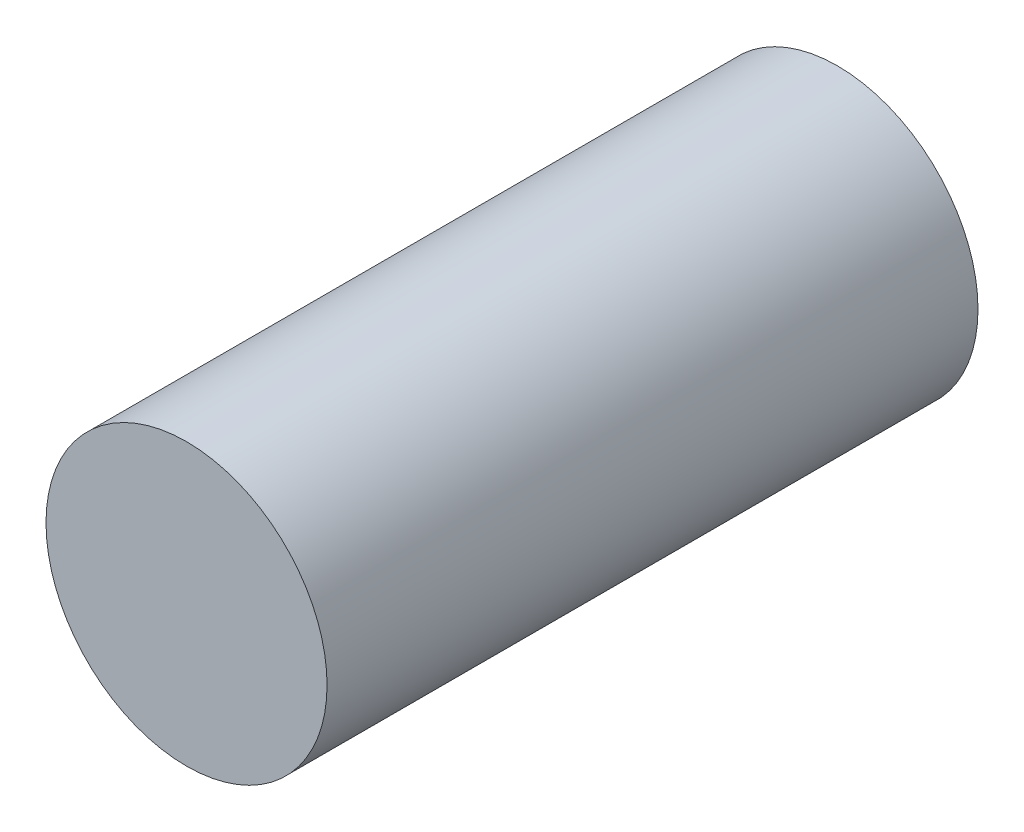
ISO-10303-21;
HEADER;
FILE_DESCRIPTION(('STEP AP214'),'2;1');
FILE_NAME('part.step','',(''),(''),'','','');
FILE_SCHEMA(('AUTOMOTIVE_DESIGN { 1 0 10303 214 1 1 1 1 }'));
ENDSEC;
DATA;
#1=APPLICATION_CONTEXT('core data for automotive mechanical design processes');
#2=APPLICATION_PROTOCOL_DEFINITION('international standard','automotive_design',2000,#1);
#3=PRODUCT_CONTEXT('',#1,'mechanical');
#4=PRODUCT('Part','Part','',(#3));
#5=PRODUCT_RELATED_PRODUCT_CATEGORY('part','',(#4));
#6=PRODUCT_DEFINITION_FORMATION('','',#4);
#7=PRODUCT_DEFINITION_CONTEXT('part definition',#1,'design');
#8=PRODUCT_DEFINITION('design','',#6,#7);
#9=PRODUCT_DEFINITION_SHAPE('','',#8);
#10=(LENGTH_UNIT() NAMED_UNIT(*) SI_UNIT(.MILLI.,.METRE.));
#11=(NAMED_UNIT(*) PLANE_ANGLE_UNIT() SI_UNIT($,.RADIAN.));
#12=(NAMED_UNIT(*) SI_UNIT($,.STERADIAN.) SOLID_ANGLE_UNIT());
#13=UNCERTAINTY_MEASURE_WITH_UNIT(LENGTH_MEASURE(1.E-05),#10,'distance_accuracy_value','');
#14=(GEOMETRIC_REPRESENTATION_CONTEXT(3) GLOBAL_UNCERTAINTY_ASSIGNED_CONTEXT((#13)) GLOBAL_UNIT_ASSIGNED_CONTEXT((#10,
#11,#12)) REPRESENTATION_CONTEXT('',''));
#15=CARTESIAN_POINT('',(0.,0.,0.));
#16=DIRECTION('',(0.,0.,1.));
#17=DIRECTION('',(1.,0.,0.));
#18=AXIS2_PLACEMENT_3D('',#15,#16,#17);
#19=CARTESIAN_POINT('',(0.,0.,11.58));
#20=DIRECTION('',(0.,0.,-1.));
#21=DIRECTION('',(-1.,0.,0.));
#22=AXIS2_PLACEMENT_3D('',#19,#20,#21);
#23=CYLINDRICAL_SURFACE('',#22,2.5);
#24=CARTESIAN_POINT('',(0.,0.,11.58));
#25=DIRECTION('',(0.,0.,1.));
#26=DIRECTION('',(1.,0.,0.));
#27=AXIS2_PLACEMENT_3D('',#24,#25,#26);
#28=CIRCLE('',#27,2.5);
#29=CARTESIAN_POINT('',(2.5,0.,11.58));
#30=VERTEX_POINT('',#29);
#31=EDGE_CURVE('E10',#30,#30,#28,.T.);
#32=ORIENTED_EDGE('',*,*,#31,.F.);
#33=EDGE_LOOP('',(#32));
#34=FACE_BOUND('',#33,.T.);
#35=CARTESIAN_POINT('',(0.,0.,0.));
#36=DIRECTION('',(0.,0.,1.));
#37=DIRECTION('',(1.,0.,0.));
#38=AXIS2_PLACEMENT_3D('',#35,#36,#37);
#39=CIRCLE('',#38,2.5);
#40=CARTESIAN_POINT('',(2.5,0.,0.));
#41=VERTEX_POINT('',#40);
#42=EDGE_CURVE('E44',#41,#41,#39,.T.);
#43=ORIENTED_EDGE('',*,*,#42,.T.);
#44=EDGE_LOOP('',(#43));
#45=FACE_BOUND('',#44,.T.);
#46=ADVANCED_FACE('F41',(#34,#45),#23,.T.);
#47=CARTESIAN_POINT('',(0.,0.,11.58));
#48=DIRECTION('',(0.,0.,1.));
#49=DIRECTION('',(1.,0.,0.));
#50=AXIS2_PLACEMENT_3D('',#47,#48,#49);
#51=PLANE('',#50);
#52=ORIENTED_EDGE('',*,*,#31,.T.);
#53=EDGE_LOOP('',(#52));
#54=FACE_BOUND('',#53,.T.);
#55=ADVANCED_FACE('F56',(#54),#51,.T.);
#56=CARTESIAN_POINT('',(0.,0.,0.));
#57=DIRECTION('',(0.,0.,1.));
#58=DIRECTION('',(1.,0.,0.));
#59=AXIS2_PLACEMENT_3D('',#56,#57,#58);
#60=PLANE('',#59);
#61=ORIENTED_EDGE('',*,*,#42,.F.);
#62=EDGE_LOOP('',(#61));
#63=FACE_BOUND('',#62,.T.);
#64=ADVANCED_FACE('F54',(#63),#60,.F.);
#65=CLOSED_SHELL('',(#46,#55,#64));
#66=MANIFOLD_SOLID_BREP('B2',#65);
#67=ADVANCED_BREP_SHAPE_REPRESENTATION('',(#18,#66),#14);
#68=SHAPE_DEFINITION_REPRESENTATION(#9,#67);
ENDSEC;
END-ISO-10303-21;
